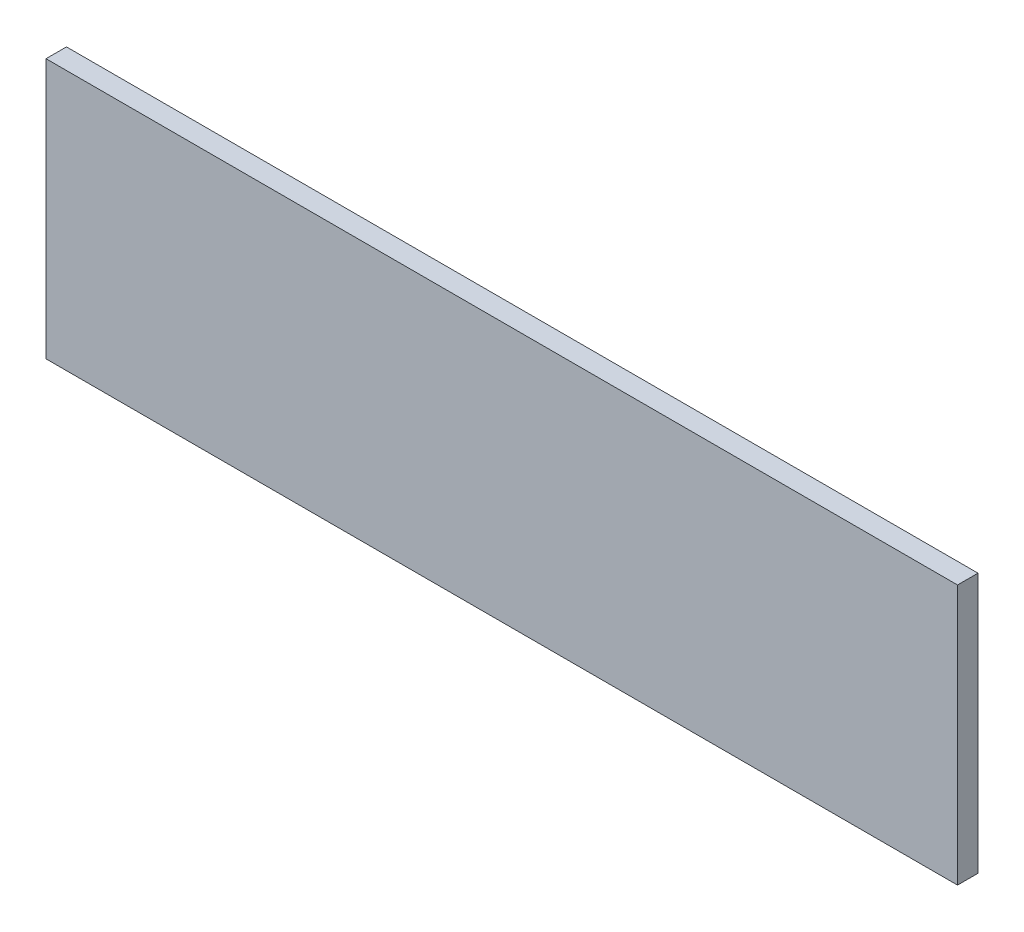
ISO-10303-21;
HEADER;
FILE_DESCRIPTION(('STEP AP214'),'2;1');
FILE_NAME('part.step','',(''),(''),'','','');
FILE_SCHEMA(('AUTOMOTIVE_DESIGN { 1 0 10303 214 1 1 1 1 }'));
ENDSEC;
DATA;
#1=APPLICATION_CONTEXT('core data for automotive mechanical design processes');
#2=APPLICATION_PROTOCOL_DEFINITION('international standard','automotive_design',2000,#1);
#3=PRODUCT_CONTEXT('',#1,'mechanical');
#4=PRODUCT('Part','Part','',(#3));
#5=PRODUCT_RELATED_PRODUCT_CATEGORY('part','',(#4));
#6=PRODUCT_DEFINITION_FORMATION('','',#4);
#7=PRODUCT_DEFINITION_CONTEXT('part definition',#1,'design');
#8=PRODUCT_DEFINITION('design','',#6,#7);
#9=PRODUCT_DEFINITION_SHAPE('','',#8);
#10=(LENGTH_UNIT() NAMED_UNIT(*) SI_UNIT(.MILLI.,.METRE.));
#11=(NAMED_UNIT(*) PLANE_ANGLE_UNIT() SI_UNIT($,.RADIAN.));
#12=(NAMED_UNIT(*) SI_UNIT($,.STERADIAN.) SOLID_ANGLE_UNIT());
#13=UNCERTAINTY_MEASURE_WITH_UNIT(LENGTH_MEASURE(1.E-05),#10,'distance_accuracy_value','');
#14=(GEOMETRIC_REPRESENTATION_CONTEXT(3) GLOBAL_UNCERTAINTY_ASSIGNED_CONTEXT((#13)) GLOBAL_UNIT_ASSIGNED_CONTEXT((#10,
#11,#12)) REPRESENTATION_CONTEXT('',''));
#15=CARTESIAN_POINT('',(0.,0.,0.));
#16=DIRECTION('',(0.,0.,1.));
#17=DIRECTION('',(1.,0.,0.));
#18=AXIS2_PLACEMENT_3D('',#15,#16,#17);
#19=CARTESIAN_POINT('',(588.229678567666,877.228278213205,3.));
#20=DIRECTION('',(1.,0.,0.));
#21=DIRECTION('',(0.,0.,-1.));
#22=AXIS2_PLACEMENT_3D('',#19,#20,#21);
#23=PLANE('',#22);
#24=DIRECTION('',(0.,-1.,0.));
#25=VECTOR('',#24,1.);
#26=CARTESIAN_POINT('',(588.229678567666,877.228278213205,0.));
#27=LINE('',#26,#25);
#28=CARTESIAN_POINT('',(588.229678567666,915.328278213205,0.));
#29=VERTEX_POINT('',#28);
#30=CARTESIAN_POINT('',(588.229678567666,877.228278213205,0.));
#31=VERTEX_POINT('',#30);
#32=EDGE_CURVE('E104',#29,#31,#27,.T.);
#33=ORIENTED_EDGE('',*,*,#32,.T.);
#34=DIRECTION('',(0.,0.,-1.));
#35=VECTOR('',#34,1.);
#36=CARTESIAN_POINT('',(588.229678567666,877.228278213205,3.));
#37=LINE('',#36,#35);
#38=CARTESIAN_POINT('',(588.229678567666,877.228278213205,3.));
#39=VERTEX_POINT('',#38);
#40=EDGE_CURVE('E11',#39,#31,#37,.T.);
#41=ORIENTED_EDGE('',*,*,#40,.F.);
#42=DIRECTION('',(0.,-1.,0.));
#43=VECTOR('',#42,1.);
#44=CARTESIAN_POINT('',(588.229678567666,877.228278213205,3.));
#45=LINE('',#44,#43);
#46=CARTESIAN_POINT('',(588.229678567666,915.328278213205,3.));
#47=VERTEX_POINT('',#46);
#48=EDGE_CURVE('E92',#47,#39,#45,.T.);
#49=ORIENTED_EDGE('',*,*,#48,.F.);
#50=DIRECTION('',(0.,0.,-1.));
#51=VECTOR('',#50,1.);
#52=CARTESIAN_POINT('',(588.229678567666,915.328278213205,3.));
#53=LINE('',#52,#51);
#54=EDGE_CURVE('E100',#47,#29,#53,.T.);
#55=ORIENTED_EDGE('',*,*,#54,.T.);
#56=EDGE_LOOP('',(#33,#41,#49,#55));
#57=FACE_BOUND('',#56,.T.);
#58=ADVANCED_FACE('F41',(#57),#23,.F.);
#59=CARTESIAN_POINT('',(721.833678567667,877.228278213205,3.));
#60=DIRECTION('',(0.,1.,0.));
#61=DIRECTION('',(0.,0.,1.));
#62=AXIS2_PLACEMENT_3D('',#59,#60,#61);
#63=PLANE('',#62);
#64=DIRECTION('',(1.,0.,0.));
#65=VECTOR('',#64,1.);
#66=CARTESIAN_POINT('',(721.833678567667,877.228278213205,0.));
#67=LINE('',#66,#65);
#68=CARTESIAN_POINT('',(721.833678567667,877.228278213205,0.));
#69=VERTEX_POINT('',#68);
#70=EDGE_CURVE('E96',#31,#69,#67,.T.);
#71=ORIENTED_EDGE('',*,*,#70,.T.);
#72=DIRECTION('',(0.,0.,-1.));
#73=VECTOR('',#72,1.);
#74=CARTESIAN_POINT('',(721.833678567667,877.228278213205,3.));
#75=LINE('',#74,#73);
#76=CARTESIAN_POINT('',(721.833678567667,877.228278213205,3.));
#77=VERTEX_POINT('',#76);
#78=EDGE_CURVE('E49',#77,#69,#75,.T.);
#79=ORIENTED_EDGE('',*,*,#78,.F.);
#80=DIRECTION('',(1.,0.,0.));
#81=VECTOR('',#80,1.);
#82=CARTESIAN_POINT('',(721.833678567667,877.228278213205,3.));
#83=LINE('',#82,#81);
#84=EDGE_CURVE('E87',#39,#77,#83,.T.);
#85=ORIENTED_EDGE('',*,*,#84,.F.);
#86=ORIENTED_EDGE('',*,*,#40,.T.);
#87=EDGE_LOOP('',(#71,#79,#85,#86));
#88=FACE_BOUND('',#87,.T.);
#89=ADVANCED_FACE('F95',(#88),#63,.F.);
#90=CARTESIAN_POINT('',(721.833678567667,915.328278213205,3.));
#91=DIRECTION('',(-1.,0.,0.));
#92=DIRECTION('',(0.,0.,1.));
#93=AXIS2_PLACEMENT_3D('',#90,#91,#92);
#94=PLANE('',#93);
#95=DIRECTION('',(0.,1.,0.));
#96=VECTOR('',#95,1.);
#97=CARTESIAN_POINT('',(721.833678567667,915.328278213205,0.));
#98=LINE('',#97,#96);
#99=CARTESIAN_POINT('',(721.833678567667,915.328278213205,0.));
#100=VERTEX_POINT('',#99);
#101=EDGE_CURVE('E74',#69,#100,#98,.T.);
#102=ORIENTED_EDGE('',*,*,#101,.T.);
#103=DIRECTION('',(0.,0.,-1.));
#104=VECTOR('',#103,1.);
#105=CARTESIAN_POINT('',(721.833678567667,915.328278213205,3.));
#106=LINE('',#105,#104);
#107=CARTESIAN_POINT('',(721.833678567667,915.328278213205,3.));
#108=VERTEX_POINT('',#107);
#109=EDGE_CURVE('E97',#108,#100,#106,.T.);
#110=ORIENTED_EDGE('',*,*,#109,.F.);
#111=DIRECTION('',(0.,1.,0.));
#112=VECTOR('',#111,1.);
#113=CARTESIAN_POINT('',(721.833678567667,915.328278213205,3.));
#114=LINE('',#113,#112);
#115=EDGE_CURVE('E90',#77,#108,#114,.T.);
#116=ORIENTED_EDGE('',*,*,#115,.F.);
#117=ORIENTED_EDGE('',*,*,#78,.T.);
#118=EDGE_LOOP('',(#102,#110,#116,#117));
#119=FACE_BOUND('',#118,.T.);
#120=ADVANCED_FACE('F98',(#119),#94,.F.);
#121=CARTESIAN_POINT('',(588.229678567666,915.328278213205,3.));
#122=DIRECTION('',(0.,-1.,0.));
#123=DIRECTION('',(0.,0.,-1.));
#124=AXIS2_PLACEMENT_3D('',#121,#122,#123);
#125=PLANE('',#124);
#126=DIRECTION('',(-1.,0.,0.));
#127=VECTOR('',#126,1.);
#128=CARTESIAN_POINT('',(588.229678567666,915.328278213205,0.));
#129=LINE('',#128,#127);
#130=EDGE_CURVE('E80',#100,#29,#129,.T.);
#131=ORIENTED_EDGE('',*,*,#130,.T.);
#132=ORIENTED_EDGE('',*,*,#54,.F.);
#133=DIRECTION('',(-1.,0.,0.));
#134=VECTOR('',#133,1.);
#135=CARTESIAN_POINT('',(588.229678567666,915.328278213205,3.));
#136=LINE('',#135,#134);
#137=EDGE_CURVE('E57',#108,#47,#136,.T.);
#138=ORIENTED_EDGE('',*,*,#137,.F.);
#139=ORIENTED_EDGE('',*,*,#109,.T.);
#140=EDGE_LOOP('',(#131,#132,#138,#139));
#141=FACE_BOUND('',#140,.T.);
#142=ADVANCED_FACE('F111',(#141),#125,.F.);
#143=CARTESIAN_POINT('',(0.,0.,3.));
#144=DIRECTION('',(0.,0.,-1.));
#145=DIRECTION('',(-1.,0.,0.));
#146=AXIS2_PLACEMENT_3D('',#143,#144,#145);
#147=PLANE('',#146);
#148=ORIENTED_EDGE('',*,*,#48,.T.);
#149=ORIENTED_EDGE('',*,*,#84,.T.);
#150=ORIENTED_EDGE('',*,*,#115,.T.);
#151=ORIENTED_EDGE('',*,*,#137,.T.);
#152=EDGE_LOOP('',(#148,#149,#150,#151));
#153=FACE_BOUND('',#152,.T.);
#154=ADVANCED_FACE('F88',(#153),#147,.F.);
#155=CARTESIAN_POINT('',(0.,0.,0.));
#156=DIRECTION('',(0.,0.,-1.));
#157=DIRECTION('',(-1.,0.,0.));
#158=AXIS2_PLACEMENT_3D('',#155,#156,#157);
#159=PLANE('',#158);
#160=ORIENTED_EDGE('',*,*,#32,.F.);
#161=ORIENTED_EDGE('',*,*,#130,.F.);
#162=ORIENTED_EDGE('',*,*,#101,.F.);
#163=ORIENTED_EDGE('',*,*,#70,.F.);
#164=EDGE_LOOP('',(#160,#161,#162,#163));
#165=FACE_BOUND('',#164,.T.);
#166=ADVANCED_FACE('F114',(#165),#159,.T.);
#167=CLOSED_SHELL('',(#58,#89,#120,#142,#154,#166));
#168=MANIFOLD_SOLID_BREP('B2',#167);
#169=ADVANCED_BREP_SHAPE_REPRESENTATION('',(#18,#168),#14);
#170=SHAPE_DEFINITION_REPRESENTATION(#9,#169);
ENDSEC;
END-ISO-10303-21;
